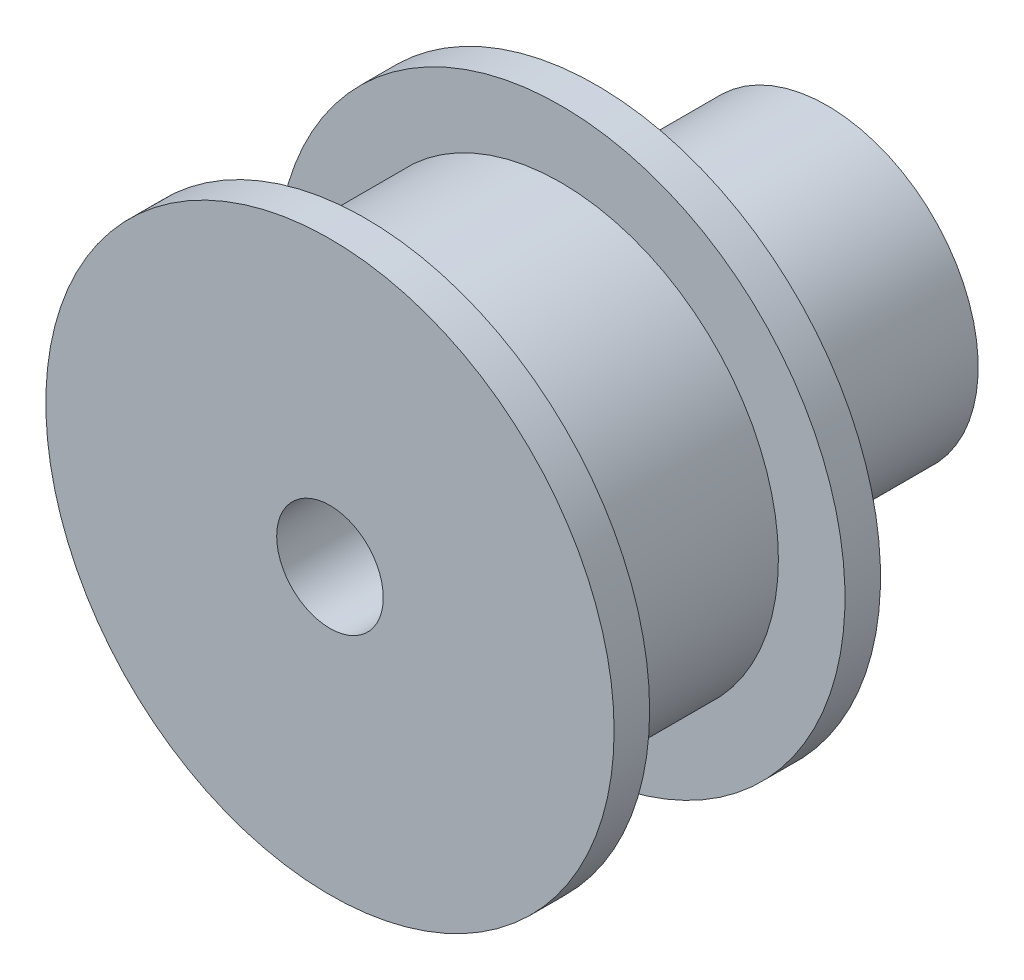
ISO-10303-21;
HEADER;
FILE_DESCRIPTION(('STEP AP214'),'2;1');
FILE_NAME('part.step','',(''),(''),'','','');
FILE_SCHEMA(('AUTOMOTIVE_DESIGN { 1 0 10303 214 1 1 1 1 }'));
ENDSEC;
DATA;
#1=APPLICATION_CONTEXT('core data for automotive mechanical design processes');
#2=APPLICATION_PROTOCOL_DEFINITION('international standard','automotive_design',2000,#1);
#3=PRODUCT_CONTEXT('',#1,'mechanical');
#4=PRODUCT('Part','Part','',(#3));
#5=PRODUCT_RELATED_PRODUCT_CATEGORY('part','',(#4));
#6=PRODUCT_DEFINITION_FORMATION('','',#4);
#7=PRODUCT_DEFINITION_CONTEXT('part definition',#1,'design');
#8=PRODUCT_DEFINITION('design','',#6,#7);
#9=PRODUCT_DEFINITION_SHAPE('','',#8);
#10=(LENGTH_UNIT() NAMED_UNIT(*) SI_UNIT(.MILLI.,.METRE.));
#11=(NAMED_UNIT(*) PLANE_ANGLE_UNIT() SI_UNIT($,.RADIAN.));
#12=(NAMED_UNIT(*) SI_UNIT($,.STERADIAN.) SOLID_ANGLE_UNIT());
#13=UNCERTAINTY_MEASURE_WITH_UNIT(LENGTH_MEASURE(1.E-05),#10,'distance_accuracy_value','');
#14=(GEOMETRIC_REPRESENTATION_CONTEXT(3) GLOBAL_UNCERTAINTY_ASSIGNED_CONTEXT((#13)) GLOBAL_UNIT_ASSIGNED_CONTEXT((#10,
#11,#12)) REPRESENTATION_CONTEXT('',''));
#15=CARTESIAN_POINT('',(0.,0.,0.));
#16=DIRECTION('',(0.,0.,1.));
#17=DIRECTION('',(1.,0.,0.));
#18=AXIS2_PLACEMENT_3D('',#15,#16,#17);
#19=CARTESIAN_POINT('',(0.,0.,-3.));
#20=DIRECTION('',(0.,0.,-1.));
#21=DIRECTION('',(-1.,0.,0.));
#22=AXIS2_PLACEMENT_3D('',#19,#20,#21);
#23=PLANE('',#22);
#24=CARTESIAN_POINT('',(0.,0.,-3.));
#25=DIRECTION('',(0.,0.,-1.));
#26=DIRECTION('',(-1.,0.,0.));
#27=AXIS2_PLACEMENT_3D('',#24,#25,#26);
#28=CIRCLE('',#27,10.);
#29=CARTESIAN_POINT('',(-10.,0.,-3.));
#30=VERTEX_POINT('',#29);
#31=EDGE_CURVE('E57',#30,#30,#28,.T.);
#32=ORIENTED_EDGE('',*,*,#31,.T.);
#33=EDGE_LOOP('',(#32));
#34=FACE_BOUND('',#33,.T.);
#35=CARTESIAN_POINT('',(0.,0.,-3.));
#36=DIRECTION('',(0.,0.,-1.));
#37=DIRECTION('',(-1.,0.,0.));
#38=AXIS2_PLACEMENT_3D('',#35,#36,#37);
#39=CIRCLE('',#38,8.5);
#40=CARTESIAN_POINT('',(-8.5,0.,-3.));
#41=VERTEX_POINT('',#40);
#42=EDGE_CURVE('E66',#41,#41,#39,.T.);
#43=ORIENTED_EDGE('',*,*,#42,.F.);
#44=EDGE_LOOP('',(#43));
#45=FACE_BOUND('',#44,.T.);
#46=ADVANCED_FACE('F33',(#34,#45),#23,.T.);
#47=CARTESIAN_POINT('',(0.,0.,-2.));
#48=DIRECTION('',(0.,0.,-1.));
#49=DIRECTION('',(-1.,0.,0.));
#50=AXIS2_PLACEMENT_3D('',#47,#48,#49);
#51=PLANE('',#50);
#52=CARTESIAN_POINT('',(0.,0.,-2.));
#53=DIRECTION('',(0.,0.,-1.));
#54=DIRECTION('',(-1.,0.,0.));
#55=AXIS2_PLACEMENT_3D('',#52,#53,#54);
#56=CIRCLE('',#55,16.);
#57=CARTESIAN_POINT('',(-16.,0.,-2.));
#58=VERTEX_POINT('',#57);
#59=EDGE_CURVE('E53',#58,#58,#56,.T.);
#60=ORIENTED_EDGE('',*,*,#59,.T.);
#61=EDGE_LOOP('',(#60));
#62=FACE_BOUND('',#61,.T.);
#63=CARTESIAN_POINT('',(0.,0.,-2.));
#64=DIRECTION('',(0.,0.,-1.));
#65=DIRECTION('',(-1.,0.,0.));
#66=AXIS2_PLACEMENT_3D('',#63,#64,#65);
#67=CIRCLE('',#66,10.);
#68=CARTESIAN_POINT('',(-10.,0.,-2.));
#69=VERTEX_POINT('',#68);
#70=EDGE_CURVE('E60',#69,#69,#67,.T.);
#71=ORIENTED_EDGE('',*,*,#70,.F.);
#72=EDGE_LOOP('',(#71));
#73=FACE_BOUND('',#72,.T.);
#74=ADVANCED_FACE('F105',(#62,#73),#51,.T.);
#75=CARTESIAN_POINT('',(0.,0.,11.));
#76=DIRECTION('',(0.,0.,-1.));
#77=DIRECTION('',(-1.,0.,0.));
#78=AXIS2_PLACEMENT_3D('',#75,#76,#77);
#79=CYLINDRICAL_SURFACE('',#78,12.25);
#80=CARTESIAN_POINT('',(0.,0.,11.));
#81=DIRECTION('',(0.,0.,1.));
#82=DIRECTION('',(1.,0.,0.));
#83=AXIS2_PLACEMENT_3D('',#80,#81,#82);
#84=CIRCLE('',#83,12.25);
#85=CARTESIAN_POINT('',(12.25,0.,11.));
#86=VERTEX_POINT('',#85);
#87=EDGE_CURVE('E44',#86,#86,#84,.T.);
#88=ORIENTED_EDGE('',*,*,#87,.F.);
#89=EDGE_LOOP('',(#88));
#90=FACE_BOUND('',#89,.T.);
#91=CARTESIAN_POINT('',(0.,0.,0.));
#92=DIRECTION('',(0.,0.,-1.));
#93=DIRECTION('',(-1.,0.,0.));
#94=AXIS2_PLACEMENT_3D('',#91,#92,#93);
#95=CIRCLE('',#94,12.25);
#96=CARTESIAN_POINT('',(-12.25,0.,0.));
#97=VERTEX_POINT('',#96);
#98=EDGE_CURVE('E48',#97,#97,#95,.T.);
#99=ORIENTED_EDGE('',*,*,#98,.F.);
#100=EDGE_LOOP('',(#99));
#101=FACE_BOUND('',#100,.T.);
#102=ADVANCED_FACE('F101',(#90,#101),#79,.T.);
#103=CARTESIAN_POINT('',(0.,0.,0.));
#104=DIRECTION('',(0.,0.,-1.));
#105=DIRECTION('',(-1.,0.,0.));
#106=AXIS2_PLACEMENT_3D('',#103,#104,#105);
#107=PLANE('',#106);
#108=CARTESIAN_POINT('',(0.,0.,0.));
#109=DIRECTION('',(0.,0.,-1.));
#110=DIRECTION('',(-1.,0.,0.));
#111=AXIS2_PLACEMENT_3D('',#108,#109,#110);
#112=CIRCLE('',#111,16.);
#113=CARTESIAN_POINT('',(-16.,0.,0.));
#114=VERTEX_POINT('',#113);
#115=EDGE_CURVE('E54',#114,#114,#112,.T.);
#116=ORIENTED_EDGE('',*,*,#115,.F.);
#117=EDGE_LOOP('',(#116));
#118=FACE_BOUND('',#117,.T.);
#119=ORIENTED_EDGE('',*,*,#98,.T.);
#120=EDGE_LOOP('',(#119));
#121=FACE_BOUND('',#120,.T.);
#122=ADVANCED_FACE('F104',(#118,#121),#107,.F.);
#123=CARTESIAN_POINT('',(0.,0.,-2.));
#124=DIRECTION('',(0.,0.,1.));
#125=DIRECTION('',(1.,0.,0.));
#126=AXIS2_PLACEMENT_3D('',#123,#124,#125);
#127=CYLINDRICAL_SURFACE('',#126,16.);
#128=ORIENTED_EDGE('',*,*,#59,.F.);
#129=EDGE_LOOP('',(#128));
#130=FACE_BOUND('',#129,.T.);
#131=ORIENTED_EDGE('',*,*,#115,.T.);
#132=EDGE_LOOP('',(#131));
#133=FACE_BOUND('',#132,.T.);
#134=ADVANCED_FACE('F109',(#130,#133),#127,.T.);
#135=CARTESIAN_POINT('',(0.,0.,-3.));
#136=DIRECTION('',(0.,0.,1.));
#137=DIRECTION('',(1.,0.,0.));
#138=AXIS2_PLACEMENT_3D('',#135,#136,#137);
#139=CYLINDRICAL_SURFACE('',#138,10.);
#140=ORIENTED_EDGE('',*,*,#31,.F.);
#141=EDGE_LOOP('',(#140));
#142=FACE_BOUND('',#141,.T.);
#143=ORIENTED_EDGE('',*,*,#70,.T.);
#144=EDGE_LOOP('',(#143));
#145=FACE_BOUND('',#144,.T.);
#146=ADVANCED_FACE('F115',(#142,#145),#139,.T.);
#147=CARTESIAN_POINT('',(0.,0.,-15.));
#148=DIRECTION('',(0.,0.,1.));
#149=DIRECTION('',(1.,0.,0.));
#150=AXIS2_PLACEMENT_3D('',#147,#148,#149);
#151=CYLINDRICAL_SURFACE('',#150,8.5);
#152=CARTESIAN_POINT('',(0.,0.,-15.));
#153=DIRECTION('',(0.,0.,-1.));
#154=DIRECTION('',(-1.,0.,0.));
#155=AXIS2_PLACEMENT_3D('',#152,#153,#154);
#156=CIRCLE('',#155,8.5);
#157=CARTESIAN_POINT('',(-8.5,0.,-15.));
#158=VERTEX_POINT('',#157);
#159=EDGE_CURVE('E63',#158,#158,#156,.T.);
#160=ORIENTED_EDGE('',*,*,#159,.F.);
#161=EDGE_LOOP('',(#160));
#162=FACE_BOUND('',#161,.T.);
#163=ORIENTED_EDGE('',*,*,#42,.T.);
#164=EDGE_LOOP('',(#163));
#165=FACE_BOUND('',#164,.T.);
#166=ADVANCED_FACE('F130',(#162,#165),#151,.T.);
#167=CARTESIAN_POINT('',(0.,0.,-15.));
#168=DIRECTION('',(0.,0.,-1.));
#169=DIRECTION('',(-1.,0.,0.));
#170=AXIS2_PLACEMENT_3D('',#167,#168,#169);
#171=PLANE('',#170);
#172=CARTESIAN_POINT('',(0.,0.,-15.));
#173=DIRECTION('',(0.,0.,-1.));
#174=DIRECTION('',(-1.,0.,0.));
#175=AXIS2_PLACEMENT_3D('',#172,#173,#174);
#176=CIRCLE('',#175,4.00000000000001);
#177=CARTESIAN_POINT('',(-4.00000000000001,0.,-15.));
#178=VERTEX_POINT('',#177);
#179=EDGE_CURVE('E10',#178,#178,#176,.F.);
#180=ORIENTED_EDGE('',*,*,#179,.T.);
#181=EDGE_LOOP('',(#180));
#182=FACE_BOUND('',#181,.T.);
#183=ORIENTED_EDGE('',*,*,#159,.T.);
#184=EDGE_LOOP('',(#183));
#185=FACE_BOUND('',#184,.T.);
#186=ADVANCED_FACE('F137',(#182,#185),#171,.T.);
#187=CARTESIAN_POINT('',(0.,0.,85.));
#188=DIRECTION('',(0.,0.,-1.));
#189=DIRECTION('',(-1.,0.,0.));
#190=AXIS2_PLACEMENT_3D('',#187,#188,#189);
#191=CYLINDRICAL_SURFACE('',#190,3.);
#192=CARTESIAN_POINT('',(0.,0.,13.));
#193=DIRECTION('',(0.,0.,1.));
#194=DIRECTION('',(1.,0.,0.));
#195=AXIS2_PLACEMENT_3D('',#192,#193,#194);
#196=CIRCLE('',#195,3.);
#197=CARTESIAN_POINT('',(3.,0.,13.));
#198=VERTEX_POINT('',#197);
#199=EDGE_CURVE('E75',#198,#198,#196,.T.);
#200=ORIENTED_EDGE('',*,*,#199,.T.);
#201=EDGE_LOOP('',(#200));
#202=FACE_BOUND('',#201,.T.);
#203=CARTESIAN_POINT('',(0.,0.,-14.));
#204=DIRECTION('',(0.,0.,-1.));
#205=DIRECTION('',(-1.,0.,0.));
#206=AXIS2_PLACEMENT_3D('',#203,#204,#205);
#207=CIRCLE('',#206,3.);
#208=CARTESIAN_POINT('',(-3.,0.,-14.));
#209=VERTEX_POINT('',#208);
#210=EDGE_CURVE('E40',#209,#209,#207,.T.);
#211=ORIENTED_EDGE('',*,*,#210,.T.);
#212=EDGE_LOOP('',(#211));
#213=FACE_BOUND('',#212,.T.);
#214=ADVANCED_FACE('F81',(#202,#213),#191,.F.);
#215=CARTESIAN_POINT('',(0.,0.,-14.));
#216=DIRECTION('',(0.,0.,-1.));
#217=DIRECTION('',(-1.,0.,0.));
#218=AXIS2_PLACEMENT_3D('',#215,#216,#217);
#219=CONICAL_SURFACE('',#218,3.,0.785398163397453);
#220=ORIENTED_EDGE('',*,*,#179,.F.);
#221=EDGE_LOOP('',(#220));
#222=FACE_BOUND('',#221,.T.);
#223=ORIENTED_EDGE('',*,*,#210,.F.);
#224=EDGE_LOOP('',(#223));
#225=FACE_BOUND('',#224,.T.);
#226=ADVANCED_FACE('F35',(#222,#225),#219,.F.);
#227=CARTESIAN_POINT('',(0.,0.,11.));
#228=DIRECTION('',(0.,0.,1.));
#229=DIRECTION('',(1.,0.,0.));
#230=AXIS2_PLACEMENT_3D('',#227,#228,#229);
#231=PLANE('',#230);
#232=CARTESIAN_POINT('',(0.,0.,11.));
#233=DIRECTION('',(0.,0.,1.));
#234=DIRECTION('',(1.,0.,0.));
#235=AXIS2_PLACEMENT_3D('',#232,#233,#234);
#236=CIRCLE('',#235,16.);
#237=CARTESIAN_POINT('',(16.,0.,11.));
#238=VERTEX_POINT('',#237);
#239=EDGE_CURVE('E72',#238,#238,#236,.T.);
#240=ORIENTED_EDGE('',*,*,#239,.F.);
#241=EDGE_LOOP('',(#240));
#242=FACE_BOUND('',#241,.T.);
#243=ORIENTED_EDGE('',*,*,#87,.T.);
#244=EDGE_LOOP('',(#243));
#245=FACE_BOUND('',#244,.T.);
#246=ADVANCED_FACE('F92',(#242,#245),#231,.F.);
#247=CARTESIAN_POINT('',(0.,0.,13.));
#248=DIRECTION('',(0.,0.,-1.));
#249=DIRECTION('',(-1.,0.,0.));
#250=AXIS2_PLACEMENT_3D('',#247,#248,#249);
#251=CYLINDRICAL_SURFACE('',#250,16.);
#252=CARTESIAN_POINT('',(0.,0.,13.));
#253=DIRECTION('',(0.,0.,1.));
#254=DIRECTION('',(1.,0.,0.));
#255=AXIS2_PLACEMENT_3D('',#252,#253,#254);
#256=CIRCLE('',#255,16.);
#257=CARTESIAN_POINT('',(16.,0.,13.));
#258=VERTEX_POINT('',#257);
#259=EDGE_CURVE('E69',#258,#258,#256,.T.);
#260=ORIENTED_EDGE('',*,*,#259,.F.);
#261=EDGE_LOOP('',(#260));
#262=FACE_BOUND('',#261,.T.);
#263=ORIENTED_EDGE('',*,*,#239,.T.);
#264=EDGE_LOOP('',(#263));
#265=FACE_BOUND('',#264,.T.);
#266=ADVANCED_FACE('F86',(#262,#265),#251,.T.);
#267=CARTESIAN_POINT('',(0.,0.,13.));
#268=DIRECTION('',(0.,0.,1.));
#269=DIRECTION('',(1.,0.,0.));
#270=AXIS2_PLACEMENT_3D('',#267,#268,#269);
#271=PLANE('',#270);
#272=ORIENTED_EDGE('',*,*,#199,.F.);
#273=EDGE_LOOP('',(#272));
#274=FACE_BOUND('',#273,.T.);
#275=ORIENTED_EDGE('',*,*,#259,.T.);
#276=EDGE_LOOP('',(#275));
#277=FACE_BOUND('',#276,.T.);
#278=ADVANCED_FACE('F83',(#274,#277),#271,.T.);
#279=CLOSED_SHELL('',(#46,#74,#102,#122,#134,#146,#166,#186,#214,#226,#246,#266,#278));
#280=MANIFOLD_SOLID_BREP('B2',#279);
#281=ADVANCED_BREP_SHAPE_REPRESENTATION('',(#18,#280),#14);
#282=SHAPE_DEFINITION_REPRESENTATION(#9,#281);
ENDSEC;
END-ISO-10303-21;
